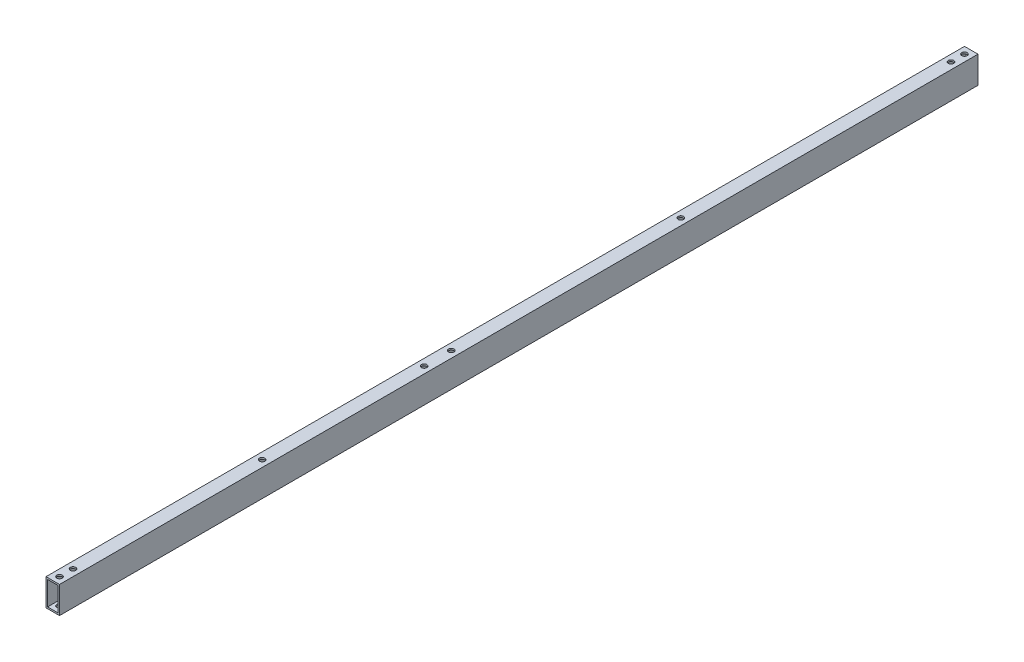
ISO-10303-21;
HEADER;
FILE_DESCRIPTION(('STEP AP214'),'2;1');
FILE_NAME('part.step','',(''),(''),'','','');
FILE_SCHEMA(('AUTOMOTIVE_DESIGN { 1 0 10303 214 1 1 1 1 }'));
ENDSEC;
DATA;
#1=APPLICATION_CONTEXT('core data for automotive mechanical design processes');
#2=APPLICATION_PROTOCOL_DEFINITION('international standard','automotive_design',2000,#1);
#3=PRODUCT_CONTEXT('',#1,'mechanical');
#4=PRODUCT('Part','Part','',(#3));
#5=PRODUCT_RELATED_PRODUCT_CATEGORY('part','',(#4));
#6=PRODUCT_DEFINITION_FORMATION('','',#4);
#7=PRODUCT_DEFINITION_CONTEXT('part definition',#1,'design');
#8=PRODUCT_DEFINITION('design','',#6,#7);
#9=PRODUCT_DEFINITION_SHAPE('','',#8);
#10=(LENGTH_UNIT() NAMED_UNIT(*) SI_UNIT(.MILLI.,.METRE.));
#11=(NAMED_UNIT(*) PLANE_ANGLE_UNIT() SI_UNIT($,.RADIAN.));
#12=(NAMED_UNIT(*) SI_UNIT($,.STERADIAN.) SOLID_ANGLE_UNIT());
#13=UNCERTAINTY_MEASURE_WITH_UNIT(LENGTH_MEASURE(1.E-05),#10,'distance_accuracy_value','');
#14=(GEOMETRIC_REPRESENTATION_CONTEXT(3) GLOBAL_UNCERTAINTY_ASSIGNED_CONTEXT((#13)) GLOBAL_UNIT_ASSIGNED_CONTEXT((#10,
#11,#12)) REPRESENTATION_CONTEXT('',''));
#15=CARTESIAN_POINT('',(0.,0.,0.));
#16=DIRECTION('',(0.,0.,1.));
#17=DIRECTION('',(1.,0.,0.));
#18=AXIS2_PLACEMENT_3D('',#15,#16,#17);
#19=CARTESIAN_POINT('',(0.,0.,680.));
#20=DIRECTION('',(0.,0.,1.));
#21=DIRECTION('',(1.,0.,0.));
#22=AXIS2_PLACEMENT_3D('',#19,#20,#21);
#23=PLANE('',#22);
#24=DIRECTION('',(0.,1.,0.));
#25=VECTOR('',#24,1.);
#26=CARTESIAN_POINT('',(5.,10.,680.));
#27=LINE('',#26,#25);
#28=CARTESIAN_POINT('',(5.,-10.,680.));
#29=VERTEX_POINT('',#28);
#30=CARTESIAN_POINT('',(5.,10.,680.));
#31=VERTEX_POINT('',#30);
#32=EDGE_CURVE('E164',#29,#31,#27,.T.);
#33=ORIENTED_EDGE('',*,*,#32,.T.);
#34=DIRECTION('',(-1.,0.,0.));
#35=VECTOR('',#34,1.);
#36=CARTESIAN_POINT('',(-5.,10.,680.));
#37=LINE('',#36,#35);
#38=CARTESIAN_POINT('',(-5.,10.,680.));
#39=VERTEX_POINT('',#38);
#40=EDGE_CURVE('E167',#31,#39,#37,.T.);
#41=ORIENTED_EDGE('',*,*,#40,.T.);
#42=DIRECTION('',(0.,-1.,0.));
#43=VECTOR('',#42,1.);
#44=CARTESIAN_POINT('',(-5.,10.,680.));
#45=LINE('',#44,#43);
#46=CARTESIAN_POINT('',(-5.,-10.,680.));
#47=VERTEX_POINT('',#46);
#48=EDGE_CURVE('E170',#39,#47,#45,.T.);
#49=ORIENTED_EDGE('',*,*,#48,.T.);
#50=DIRECTION('',(1.,0.,0.));
#51=VECTOR('',#50,1.);
#52=CARTESIAN_POINT('',(-5.,-10.,680.));
#53=LINE('',#52,#51);
#54=EDGE_CURVE('E172',#47,#29,#53,.T.);
#55=ORIENTED_EDGE('',*,*,#54,.T.);
#56=EDGE_LOOP('',(#33,#41,#49,#55));
#57=FACE_BOUND('',#56,.T.);
#58=DIRECTION('',(-1.,0.,0.));
#59=VECTOR('',#58,1.);
#60=CARTESIAN_POINT('',(-5.,8.8,680.));
#61=LINE('',#60,#59);
#62=CARTESIAN_POINT('',(3.8,8.8,680.));
#63=VERTEX_POINT('',#62);
#64=CARTESIAN_POINT('',(-3.8,8.8,680.));
#65=VERTEX_POINT('',#64);
#66=EDGE_CURVE('E134',#63,#65,#61,.T.);
#67=ORIENTED_EDGE('',*,*,#66,.F.);
#68=DIRECTION('',(0.,1.,0.));
#69=VECTOR('',#68,1.);
#70=CARTESIAN_POINT('',(3.8,10.,680.));
#71=LINE('',#70,#69);
#72=CARTESIAN_POINT('',(3.8,-8.8,680.));
#73=VERTEX_POINT('',#72);
#74=EDGE_CURVE('E126',#73,#63,#71,.T.);
#75=ORIENTED_EDGE('',*,*,#74,.F.);
#76=DIRECTION('',(1.,0.,0.));
#77=VECTOR('',#76,1.);
#78=CARTESIAN_POINT('',(-5.,-8.8,680.));
#79=LINE('',#78,#77);
#80=CARTESIAN_POINT('',(-3.8,-8.8,680.));
#81=VERTEX_POINT('',#80);
#82=EDGE_CURVE('E148',#81,#73,#79,.T.);
#83=ORIENTED_EDGE('',*,*,#82,.F.);
#84=DIRECTION('',(0.,-1.,0.));
#85=VECTOR('',#84,1.);
#86=CARTESIAN_POINT('',(-3.8,10.,680.));
#87=LINE('',#86,#85);
#88=EDGE_CURVE('E146',#65,#81,#87,.T.);
#89=ORIENTED_EDGE('',*,*,#88,.F.);
#90=EDGE_LOOP('',(#67,#75,#83,#89));
#91=FACE_BOUND('',#90,.T.);
#92=ADVANCED_FACE('F59',(#57,#91),#23,.T.);
#93=CARTESIAN_POINT('',(0.,0.,0.));
#94=DIRECTION('',(0.,0.,1.));
#95=DIRECTION('',(1.,0.,0.));
#96=AXIS2_PLACEMENT_3D('',#93,#94,#95);
#97=PLANE('',#96);
#98=DIRECTION('',(0.,1.,0.));
#99=VECTOR('',#98,1.);
#100=CARTESIAN_POINT('',(5.,10.,0.));
#101=LINE('',#100,#99);
#102=CARTESIAN_POINT('',(5.,-10.,0.));
#103=VERTEX_POINT('',#102);
#104=CARTESIAN_POINT('',(5.,10.,0.));
#105=VERTEX_POINT('',#104);
#106=EDGE_CURVE('E142',#103,#105,#101,.T.);
#107=ORIENTED_EDGE('',*,*,#106,.F.);
#108=DIRECTION('',(1.,0.,0.));
#109=VECTOR('',#108,1.);
#110=CARTESIAN_POINT('',(-5.,-10.,0.));
#111=LINE('',#110,#109);
#112=CARTESIAN_POINT('',(-5.,-10.,0.));
#113=VERTEX_POINT('',#112);
#114=EDGE_CURVE('E168',#113,#103,#111,.T.);
#115=ORIENTED_EDGE('',*,*,#114,.F.);
#116=DIRECTION('',(0.,-1.,0.));
#117=VECTOR('',#116,1.);
#118=CARTESIAN_POINT('',(-5.,10.,0.));
#119=LINE('',#118,#117);
#120=CARTESIAN_POINT('',(-5.,10.,0.));
#121=VERTEX_POINT('',#120);
#122=EDGE_CURVE('E179',#121,#113,#119,.T.);
#123=ORIENTED_EDGE('',*,*,#122,.F.);
#124=DIRECTION('',(-1.,0.,0.));
#125=VECTOR('',#124,1.);
#126=CARTESIAN_POINT('',(-5.,10.,0.));
#127=LINE('',#126,#125);
#128=EDGE_CURVE('E177',#105,#121,#127,.T.);
#129=ORIENTED_EDGE('',*,*,#128,.F.);
#130=EDGE_LOOP('',(#107,#115,#123,#129));
#131=FACE_BOUND('',#130,.T.);
#132=DIRECTION('',(0.,1.,0.));
#133=VECTOR('',#132,1.);
#134=CARTESIAN_POINT('',(3.8,10.,0.));
#135=LINE('',#134,#133);
#136=CARTESIAN_POINT('',(3.8,-8.8,0.));
#137=VERTEX_POINT('',#136);
#138=CARTESIAN_POINT('',(3.8,8.8,0.));
#139=VERTEX_POINT('',#138);
#140=EDGE_CURVE('E84',#137,#139,#135,.T.);
#141=ORIENTED_EDGE('',*,*,#140,.T.);
#142=DIRECTION('',(-1.,0.,0.));
#143=VECTOR('',#142,1.);
#144=CARTESIAN_POINT('',(-5.,8.8,0.));
#145=LINE('',#144,#143);
#146=CARTESIAN_POINT('',(-3.8,8.8,0.));
#147=VERTEX_POINT('',#146);
#148=EDGE_CURVE('E141',#139,#147,#145,.T.);
#149=ORIENTED_EDGE('',*,*,#148,.T.);
#150=DIRECTION('',(0.,-1.,0.));
#151=VECTOR('',#150,1.);
#152=CARTESIAN_POINT('',(-3.8,10.,0.));
#153=LINE('',#152,#151);
#154=CARTESIAN_POINT('',(-3.8,-8.8,0.));
#155=VERTEX_POINT('',#154);
#156=EDGE_CURVE('E156',#147,#155,#153,.T.);
#157=ORIENTED_EDGE('',*,*,#156,.T.);
#158=DIRECTION('',(1.,0.,0.));
#159=VECTOR('',#158,1.);
#160=CARTESIAN_POINT('',(-5.,-8.8,0.));
#161=LINE('',#160,#159);
#162=EDGE_CURVE('E135',#155,#137,#161,.T.);
#163=ORIENTED_EDGE('',*,*,#162,.T.);
#164=EDGE_LOOP('',(#141,#149,#157,#163));
#165=FACE_BOUND('',#164,.T.);
#166=ADVANCED_FACE('F255',(#131,#165),#97,.F.);
#167=CARTESIAN_POINT('',(5.,10.,680.));
#168=DIRECTION('',(-1.,0.,0.));
#169=DIRECTION('',(0.,-1.,0.));
#170=AXIS2_PLACEMENT_3D('',#167,#168,#169);
#171=PLANE('',#170);
#172=ORIENTED_EDGE('',*,*,#106,.T.);
#173=DIRECTION('',(0.,0.,-1.));
#174=VECTOR('',#173,1.);
#175=CARTESIAN_POINT('',(5.,10.,680.));
#176=LINE('',#175,#174);
#177=EDGE_CURVE('E12',#31,#105,#176,.T.);
#178=ORIENTED_EDGE('',*,*,#177,.F.);
#179=ORIENTED_EDGE('',*,*,#32,.F.);
#180=DIRECTION('',(0.,0.,-1.));
#181=VECTOR('',#180,1.);
#182=CARTESIAN_POINT('',(5.,-10.,680.));
#183=LINE('',#182,#181);
#184=EDGE_CURVE('E174',#29,#103,#183,.T.);
#185=ORIENTED_EDGE('',*,*,#184,.T.);
#186=EDGE_LOOP('',(#172,#178,#179,#185));
#187=FACE_BOUND('',#186,.T.);
#188=ADVANCED_FACE('F61',(#187),#171,.F.);
#189=CARTESIAN_POINT('',(-5.,10.,680.));
#190=DIRECTION('',(0.,-1.,0.));
#191=DIRECTION('',(0.,0.,-1.));
#192=AXIS2_PLACEMENT_3D('',#189,#190,#191);
#193=PLANE('',#192);
#194=CARTESIAN_POINT('',(0.,10.,525.));
#195=DIRECTION('',(0.,1.,0.));
#196=DIRECTION('',(0.,0.,1.));
#197=AXIS2_PLACEMENT_3D('',#194,#195,#196);
#198=CIRCLE('',#197,1.99999999999999);
#199=CARTESIAN_POINT('',(0.,10.,527.));
#200=VERTEX_POINT('',#199);
#201=EDGE_CURVE('E291',#200,#200,#198,.T.);
#202=ORIENTED_EDGE('',*,*,#201,.F.);
#203=EDGE_LOOP('',(#202));
#204=FACE_BOUND('',#203,.T.);
#205=CARTESIAN_POINT('',(0.,10.,15.));
#206=DIRECTION('',(0.,1.,0.));
#207=DIRECTION('',(0.,0.,-1.));
#208=AXIS2_PLACEMENT_3D('',#205,#206,#207);
#209=CIRCLE('',#208,2.);
#210=CARTESIAN_POINT('',(0.,10.,13.));
#211=VERTEX_POINT('',#210);
#212=EDGE_CURVE('E295',#211,#211,#209,.T.);
#213=ORIENTED_EDGE('',*,*,#212,.F.);
#214=EDGE_LOOP('',(#213));
#215=FACE_BOUND('',#214,.T.);
#216=CARTESIAN_POINT('',(0.,10.,5.));
#217=DIRECTION('',(0.,1.,0.));
#218=DIRECTION('',(0.,0.,-1.));
#219=AXIS2_PLACEMENT_3D('',#216,#217,#218);
#220=CIRCLE('',#219,2.);
#221=CARTESIAN_POINT('',(0.,10.,3.));
#222=VERTEX_POINT('',#221);
#223=EDGE_CURVE('E299',#222,#222,#220,.T.);
#224=ORIENTED_EDGE('',*,*,#223,.F.);
#225=EDGE_LOOP('',(#224));
#226=FACE_BOUND('',#225,.T.);
#227=CARTESIAN_POINT('',(0.,10.,675.));
#228=DIRECTION('',(0.,1.,0.));
#229=DIRECTION('',(0.,0.,1.));
#230=AXIS2_PLACEMENT_3D('',#227,#228,#229);
#231=CIRCLE('',#230,2.);
#232=CARTESIAN_POINT('',(0.,10.,677.));
#233=VERTEX_POINT('',#232);
#234=EDGE_CURVE('E303',#233,#233,#231,.T.);
#235=ORIENTED_EDGE('',*,*,#234,.F.);
#236=EDGE_LOOP('',(#235));
#237=FACE_BOUND('',#236,.T.);
#238=CARTESIAN_POINT('',(-4.80234859844007E-13,10.,385.));
#239=DIRECTION('',(0.,1.,0.));
#240=DIRECTION('',(0.,0.,1.));
#241=AXIS2_PLACEMENT_3D('',#238,#239,#240);
#242=CIRCLE('',#241,2.);
#243=CARTESIAN_POINT('',(-4.80234859844007E-13,10.,387.));
#244=VERTEX_POINT('',#243);
#245=EDGE_CURVE('E307',#244,#244,#242,.T.);
#246=ORIENTED_EDGE('',*,*,#245,.F.);
#247=EDGE_LOOP('',(#246));
#248=FACE_BOUND('',#247,.T.);
#249=CARTESIAN_POINT('',(0.,10.,215.));
#250=DIRECTION('',(0.,1.,0.));
#251=DIRECTION('',(0.,0.,1.));
#252=AXIS2_PLACEMENT_3D('',#249,#250,#251);
#253=CIRCLE('',#252,2.);
#254=CARTESIAN_POINT('',(0.,10.,217.));
#255=VERTEX_POINT('',#254);
#256=EDGE_CURVE('E311',#255,#255,#253,.T.);
#257=ORIENTED_EDGE('',*,*,#256,.F.);
#258=EDGE_LOOP('',(#257));
#259=FACE_BOUND('',#258,.T.);
#260=CARTESIAN_POINT('',(-4.11629879866292E-13,10.,405.));
#261=DIRECTION('',(0.,1.,0.));
#262=DIRECTION('',(0.,0.,1.));
#263=AXIS2_PLACEMENT_3D('',#260,#261,#262);
#264=CIRCLE('',#263,2.);
#265=CARTESIAN_POINT('',(-4.11629879866292E-13,10.,407.));
#266=VERTEX_POINT('',#265);
#267=EDGE_CURVE('E315',#266,#266,#264,.T.);
#268=ORIENTED_EDGE('',*,*,#267,.F.);
#269=EDGE_LOOP('',(#268));
#270=FACE_BOUND('',#269,.T.);
#271=CARTESIAN_POINT('',(0.,10.,665.));
#272=DIRECTION('',(0.,1.,0.));
#273=DIRECTION('',(0.,0.,1.));
#274=AXIS2_PLACEMENT_3D('',#271,#272,#273);
#275=CIRCLE('',#274,2.);
#276=CARTESIAN_POINT('',(0.,10.,667.));
#277=VERTEX_POINT('',#276);
#278=EDGE_CURVE('E319',#277,#277,#275,.T.);
#279=ORIENTED_EDGE('',*,*,#278,.F.);
#280=EDGE_LOOP('',(#279));
#281=FACE_BOUND('',#280,.T.);
#282=ORIENTED_EDGE('',*,*,#128,.T.);
#283=DIRECTION('',(0.,0.,-1.));
#284=VECTOR('',#283,1.);
#285=CARTESIAN_POINT('',(-5.,10.,680.));
#286=LINE('',#285,#284);
#287=EDGE_CURVE('E68',#39,#121,#286,.T.);
#288=ORIENTED_EDGE('',*,*,#287,.F.);
#289=ORIENTED_EDGE('',*,*,#40,.F.);
#290=ORIENTED_EDGE('',*,*,#177,.T.);
#291=EDGE_LOOP('',(#282,#288,#289,#290));
#292=FACE_BOUND('',#291,.T.);
#293=ADVANCED_FACE('F280',(#204,#215,#226,#237,#248,#259,#270,#281,#292),#193,.F.);
#294=CARTESIAN_POINT('',(-5.,10.,680.));
#295=DIRECTION('',(1.,0.,0.));
#296=DIRECTION('',(0.,1.,0.));
#297=AXIS2_PLACEMENT_3D('',#294,#295,#296);
#298=PLANE('',#297);
#299=ORIENTED_EDGE('',*,*,#122,.T.);
#300=DIRECTION('',(0.,0.,-1.));
#301=VECTOR('',#300,1.);
#302=CARTESIAN_POINT('',(-5.,-10.,680.));
#303=LINE('',#302,#301);
#304=EDGE_CURVE('E184',#47,#113,#303,.T.);
#305=ORIENTED_EDGE('',*,*,#304,.F.);
#306=ORIENTED_EDGE('',*,*,#48,.F.);
#307=ORIENTED_EDGE('',*,*,#287,.T.);
#308=EDGE_LOOP('',(#299,#305,#306,#307));
#309=FACE_BOUND('',#308,.T.);
#310=ADVANCED_FACE('F277',(#309),#298,.F.);
#311=CARTESIAN_POINT('',(-5.,-10.,680.));
#312=DIRECTION('',(0.,1.,0.));
#313=DIRECTION('',(0.,0.,1.));
#314=AXIS2_PLACEMENT_3D('',#311,#312,#313);
#315=PLANE('',#314);
#316=CARTESIAN_POINT('',(0.,-10.,525.));
#317=DIRECTION('',(0.,1.,0.));
#318=DIRECTION('',(0.,0.,1.));
#319=AXIS2_PLACEMENT_3D('',#316,#317,#318);
#320=CIRCLE('',#319,1.99999999999999);
#321=CARTESIAN_POINT('',(0.,-10.,527.));
#322=VERTEX_POINT('',#321);
#323=EDGE_CURVE('E424',#322,#322,#320,.T.);
#324=ORIENTED_EDGE('',*,*,#323,.T.);
#325=EDGE_LOOP('',(#324));
#326=FACE_BOUND('',#325,.T.);
#327=CARTESIAN_POINT('',(0.,-10.,15.));
#328=DIRECTION('',(0.,1.,0.));
#329=DIRECTION('',(0.,0.,-1.));
#330=AXIS2_PLACEMENT_3D('',#327,#328,#329);
#331=CIRCLE('',#330,2.);
#332=CARTESIAN_POINT('',(0.,-10.,13.));
#333=VERTEX_POINT('',#332);
#334=EDGE_CURVE('E416',#333,#333,#331,.T.);
#335=ORIENTED_EDGE('',*,*,#334,.T.);
#336=EDGE_LOOP('',(#335));
#337=FACE_BOUND('',#336,.T.);
#338=CARTESIAN_POINT('',(0.,-10.,5.));
#339=DIRECTION('',(0.,1.,0.));
#340=DIRECTION('',(0.,0.,-1.));
#341=AXIS2_PLACEMENT_3D('',#338,#339,#340);
#342=CIRCLE('',#341,2.);
#343=CARTESIAN_POINT('',(0.,-10.,3.));
#344=VERTEX_POINT('',#343);
#345=EDGE_CURVE('E415',#344,#344,#342,.T.);
#346=ORIENTED_EDGE('',*,*,#345,.T.);
#347=EDGE_LOOP('',(#346));
#348=FACE_BOUND('',#347,.T.);
#349=CARTESIAN_POINT('',(0.,-10.,675.));
#350=DIRECTION('',(0.,1.,0.));
#351=DIRECTION('',(0.,0.,1.));
#352=AXIS2_PLACEMENT_3D('',#349,#350,#351);
#353=CIRCLE('',#352,2.);
#354=CARTESIAN_POINT('',(0.,-10.,677.));
#355=VERTEX_POINT('',#354);
#356=EDGE_CURVE('E332',#355,#355,#353,.T.);
#357=ORIENTED_EDGE('',*,*,#356,.T.);
#358=EDGE_LOOP('',(#357));
#359=FACE_BOUND('',#358,.T.);
#360=CARTESIAN_POINT('',(-4.80234859844007E-13,-10.,385.));
#361=DIRECTION('',(0.,1.,0.));
#362=DIRECTION('',(0.,0.,1.));
#363=AXIS2_PLACEMENT_3D('',#360,#361,#362);
#364=CIRCLE('',#363,2.);
#365=CARTESIAN_POINT('',(-4.80234859844007E-13,-10.,387.));
#366=VERTEX_POINT('',#365);
#367=EDGE_CURVE('E431',#366,#366,#364,.T.);
#368=ORIENTED_EDGE('',*,*,#367,.T.);
#369=EDGE_LOOP('',(#368));
#370=FACE_BOUND('',#369,.T.);
#371=CARTESIAN_POINT('',(0.,-10.,215.));
#372=DIRECTION('',(0.,1.,0.));
#373=DIRECTION('',(0.,0.,1.));
#374=AXIS2_PLACEMENT_3D('',#371,#372,#373);
#375=CIRCLE('',#374,2.);
#376=CARTESIAN_POINT('',(0.,-10.,217.));
#377=VERTEX_POINT('',#376);
#378=EDGE_CURVE('E430',#377,#377,#375,.T.);
#379=ORIENTED_EDGE('',*,*,#378,.T.);
#380=EDGE_LOOP('',(#379));
#381=FACE_BOUND('',#380,.T.);
#382=CARTESIAN_POINT('',(-4.11629879866292E-13,-10.,405.));
#383=DIRECTION('',(0.,1.,0.));
#384=DIRECTION('',(0.,0.,1.));
#385=AXIS2_PLACEMENT_3D('',#382,#383,#384);
#386=CIRCLE('',#385,2.);
#387=CARTESIAN_POINT('',(-4.11629879866292E-13,-10.,407.));
#388=VERTEX_POINT('',#387);
#389=EDGE_CURVE('E425',#388,#388,#386,.T.);
#390=ORIENTED_EDGE('',*,*,#389,.T.);
#391=EDGE_LOOP('',(#390));
#392=FACE_BOUND('',#391,.T.);
#393=CARTESIAN_POINT('',(0.,-10.,665.));
#394=DIRECTION('',(0.,1.,0.));
#395=DIRECTION('',(0.,0.,1.));
#396=AXIS2_PLACEMENT_3D('',#393,#394,#395);
#397=CIRCLE('',#396,2.);
#398=CARTESIAN_POINT('',(0.,-10.,667.));
#399=VERTEX_POINT('',#398);
#400=EDGE_CURVE('E193',#399,#399,#397,.T.);
#401=ORIENTED_EDGE('',*,*,#400,.T.);
#402=EDGE_LOOP('',(#401));
#403=FACE_BOUND('',#402,.T.);
#404=ORIENTED_EDGE('',*,*,#114,.T.);
#405=ORIENTED_EDGE('',*,*,#184,.F.);
#406=ORIENTED_EDGE('',*,*,#54,.F.);
#407=ORIENTED_EDGE('',*,*,#304,.T.);
#408=EDGE_LOOP('',(#404,#405,#406,#407));
#409=FACE_BOUND('',#408,.T.);
#410=ADVANCED_FACE('F274',(#326,#337,#348,#359,#370,#381,#392,#403,#409),#315,.F.);
#411=CARTESIAN_POINT('',(3.8,10.,680.));
#412=DIRECTION('',(-1.,0.,0.));
#413=DIRECTION('',(0.,-1.,0.));
#414=AXIS2_PLACEMENT_3D('',#411,#412,#413);
#415=PLANE('',#414);
#416=ORIENTED_EDGE('',*,*,#140,.F.);
#417=DIRECTION('',(0.,0.,-1.));
#418=VECTOR('',#417,1.);
#419=CARTESIAN_POINT('',(3.8,-8.8,680.));
#420=LINE('',#419,#418);
#421=EDGE_CURVE('E130',#73,#137,#420,.T.);
#422=ORIENTED_EDGE('',*,*,#421,.F.);
#423=ORIENTED_EDGE('',*,*,#74,.T.);
#424=DIRECTION('',(0.,0.,-1.));
#425=VECTOR('',#424,1.);
#426=CARTESIAN_POINT('',(3.8,8.8,680.));
#427=LINE('',#426,#425);
#428=EDGE_CURVE('E129',#63,#139,#427,.T.);
#429=ORIENTED_EDGE('',*,*,#428,.T.);
#430=EDGE_LOOP('',(#416,#422,#423,#429));
#431=FACE_BOUND('',#430,.T.);
#432=ADVANCED_FACE('F128',(#431),#415,.T.);
#433=CARTESIAN_POINT('',(-5.,8.8,680.));
#434=DIRECTION('',(0.,-1.,0.));
#435=DIRECTION('',(0.,0.,-1.));
#436=AXIS2_PLACEMENT_3D('',#433,#434,#435);
#437=PLANE('',#436);
#438=CARTESIAN_POINT('',(0.,8.8,525.));
#439=DIRECTION('',(0.,-1.,0.));
#440=DIRECTION('',(0.,0.,-1.));
#441=AXIS2_PLACEMENT_3D('',#438,#439,#440);
#442=CIRCLE('',#441,1.99999999999999);
#443=CARTESIAN_POINT('',(0.,8.8,523.));
#444=VERTEX_POINT('',#443);
#445=EDGE_CURVE('E154',#444,#444,#442,.T.);
#446=ORIENTED_EDGE('',*,*,#445,.F.);
#447=EDGE_LOOP('',(#446));
#448=FACE_BOUND('',#447,.T.);
#449=CARTESIAN_POINT('',(0.,8.8,15.));
#450=DIRECTION('',(0.,-1.,0.));
#451=DIRECTION('',(0.,0.,-1.));
#452=AXIS2_PLACEMENT_3D('',#449,#450,#451);
#453=CIRCLE('',#452,2.);
#454=CARTESIAN_POINT('',(0.,8.8,13.));
#455=VERTEX_POINT('',#454);
#456=EDGE_CURVE('E215',#455,#455,#453,.T.);
#457=ORIENTED_EDGE('',*,*,#456,.F.);
#458=EDGE_LOOP('',(#457));
#459=FACE_BOUND('',#458,.T.);
#460=CARTESIAN_POINT('',(0.,8.8,5.));
#461=DIRECTION('',(0.,-1.,0.));
#462=DIRECTION('',(0.,0.,-1.));
#463=AXIS2_PLACEMENT_3D('',#460,#461,#462);
#464=CIRCLE('',#463,2.);
#465=CARTESIAN_POINT('',(0.,8.8,3.));
#466=VERTEX_POINT('',#465);
#467=EDGE_CURVE('E212',#466,#466,#464,.T.);
#468=ORIENTED_EDGE('',*,*,#467,.F.);
#469=EDGE_LOOP('',(#468));
#470=FACE_BOUND('',#469,.T.);
#471=CARTESIAN_POINT('',(0.,8.8,675.));
#472=DIRECTION('',(0.,-1.,0.));
#473=DIRECTION('',(0.,0.,-1.));
#474=AXIS2_PLACEMENT_3D('',#471,#472,#473);
#475=CIRCLE('',#474,2.);
#476=CARTESIAN_POINT('',(0.,8.8,673.));
#477=VERTEX_POINT('',#476);
#478=EDGE_CURVE('E209',#477,#477,#475,.T.);
#479=ORIENTED_EDGE('',*,*,#478,.F.);
#480=EDGE_LOOP('',(#479));
#481=FACE_BOUND('',#480,.T.);
#482=CARTESIAN_POINT('',(-4.80234859844007E-13,8.8,385.));
#483=DIRECTION('',(0.,-1.,0.));
#484=DIRECTION('',(0.,0.,-1.));
#485=AXIS2_PLACEMENT_3D('',#482,#483,#484);
#486=CIRCLE('',#485,2.);
#487=CARTESIAN_POINT('',(-4.80234859844007E-13,8.8,383.));
#488=VERTEX_POINT('',#487);
#489=EDGE_CURVE('E205',#488,#488,#486,.T.);
#490=ORIENTED_EDGE('',*,*,#489,.F.);
#491=EDGE_LOOP('',(#490));
#492=FACE_BOUND('',#491,.T.);
#493=CARTESIAN_POINT('',(0.,8.8,215.));
#494=DIRECTION('',(0.,-1.,0.));
#495=DIRECTION('',(0.,0.,-1.));
#496=AXIS2_PLACEMENT_3D('',#493,#494,#495);
#497=CIRCLE('',#496,2.);
#498=CARTESIAN_POINT('',(0.,8.8,213.));
#499=VERTEX_POINT('',#498);
#500=EDGE_CURVE('E201',#499,#499,#497,.T.);
#501=ORIENTED_EDGE('',*,*,#500,.F.);
#502=EDGE_LOOP('',(#501));
#503=FACE_BOUND('',#502,.T.);
#504=CARTESIAN_POINT('',(-4.11629879866292E-13,8.8,405.));
#505=DIRECTION('',(0.,-1.,0.));
#506=DIRECTION('',(0.,0.,-1.));
#507=AXIS2_PLACEMENT_3D('',#504,#505,#506);
#508=CIRCLE('',#507,2.);
#509=CARTESIAN_POINT('',(-4.11629879866292E-13,8.8,403.));
#510=VERTEX_POINT('',#509);
#511=EDGE_CURVE('E197',#510,#510,#508,.T.);
#512=ORIENTED_EDGE('',*,*,#511,.F.);
#513=EDGE_LOOP('',(#512));
#514=FACE_BOUND('',#513,.T.);
#515=CARTESIAN_POINT('',(0.,8.8,665.));
#516=DIRECTION('',(0.,-1.,0.));
#517=DIRECTION('',(0.,0.,-1.));
#518=AXIS2_PLACEMENT_3D('',#515,#516,#517);
#519=CIRCLE('',#518,2.);
#520=CARTESIAN_POINT('',(0.,8.8,663.));
#521=VERTEX_POINT('',#520);
#522=EDGE_CURVE('E192',#521,#521,#519,.T.);
#523=ORIENTED_EDGE('',*,*,#522,.F.);
#524=EDGE_LOOP('',(#523));
#525=FACE_BOUND('',#524,.T.);
#526=ORIENTED_EDGE('',*,*,#148,.F.);
#527=ORIENTED_EDGE('',*,*,#428,.F.);
#528=ORIENTED_EDGE('',*,*,#66,.T.);
#529=DIRECTION('',(0.,0.,-1.));
#530=VECTOR('',#529,1.);
#531=CARTESIAN_POINT('',(-3.8,8.8,680.));
#532=LINE('',#531,#530);
#533=EDGE_CURVE('E143',#65,#147,#532,.T.);
#534=ORIENTED_EDGE('',*,*,#533,.T.);
#535=EDGE_LOOP('',(#526,#527,#528,#534));
#536=FACE_BOUND('',#535,.T.);
#537=ADVANCED_FACE('F138',(#448,#459,#470,#481,#492,#503,#514,#525,#536),#437,.T.);
#538=CARTESIAN_POINT('',(-3.8,10.,680.));
#539=DIRECTION('',(1.,0.,0.));
#540=DIRECTION('',(0.,1.,0.));
#541=AXIS2_PLACEMENT_3D('',#538,#539,#540);
#542=PLANE('',#541);
#543=ORIENTED_EDGE('',*,*,#156,.F.);
#544=ORIENTED_EDGE('',*,*,#533,.F.);
#545=ORIENTED_EDGE('',*,*,#88,.T.);
#546=DIRECTION('',(0.,0.,-1.));
#547=VECTOR('',#546,1.);
#548=CARTESIAN_POINT('',(-3.8,-8.8,680.));
#549=LINE('',#548,#547);
#550=EDGE_CURVE('E76',#81,#155,#549,.T.);
#551=ORIENTED_EDGE('',*,*,#550,.T.);
#552=EDGE_LOOP('',(#543,#544,#545,#551));
#553=FACE_BOUND('',#552,.T.);
#554=ADVANCED_FACE('F239',(#553),#542,.T.);
#555=CARTESIAN_POINT('',(-5.,-8.8,680.));
#556=DIRECTION('',(0.,1.,0.));
#557=DIRECTION('',(0.,0.,1.));
#558=AXIS2_PLACEMENT_3D('',#555,#556,#557);
#559=PLANE('',#558);
#560=CARTESIAN_POINT('',(0.,-8.8,525.));
#561=DIRECTION('',(0.,1.,0.));
#562=DIRECTION('',(0.,0.,1.));
#563=AXIS2_PLACEMENT_3D('',#560,#561,#562);
#564=CIRCLE('',#563,1.99999999999999);
#565=CARTESIAN_POINT('',(0.,-8.8,527.));
#566=VERTEX_POINT('',#565);
#567=EDGE_CURVE('E63',#566,#566,#564,.T.);
#568=ORIENTED_EDGE('',*,*,#567,.F.);
#569=EDGE_LOOP('',(#568));
#570=FACE_BOUND('',#569,.T.);
#571=CARTESIAN_POINT('',(0.,-8.8,15.));
#572=DIRECTION('',(0.,1.,0.));
#573=DIRECTION('',(0.,0.,1.));
#574=AXIS2_PLACEMENT_3D('',#571,#572,#573);
#575=CIRCLE('',#574,2.);
#576=CARTESIAN_POINT('',(0.,-8.8,17.));
#577=VERTEX_POINT('',#576);
#578=EDGE_CURVE('E213',#577,#577,#575,.T.);
#579=ORIENTED_EDGE('',*,*,#578,.F.);
#580=EDGE_LOOP('',(#579));
#581=FACE_BOUND('',#580,.T.);
#582=CARTESIAN_POINT('',(0.,-8.8,5.));
#583=DIRECTION('',(0.,1.,0.));
#584=DIRECTION('',(0.,0.,1.));
#585=AXIS2_PLACEMENT_3D('',#582,#583,#584);
#586=CIRCLE('',#585,2.);
#587=CARTESIAN_POINT('',(0.,-8.8,7.00000000000001));
#588=VERTEX_POINT('',#587);
#589=EDGE_CURVE('E210',#588,#588,#586,.T.);
#590=ORIENTED_EDGE('',*,*,#589,.F.);
#591=EDGE_LOOP('',(#590));
#592=FACE_BOUND('',#591,.T.);
#593=CARTESIAN_POINT('',(0.,-8.8,675.));
#594=DIRECTION('',(0.,1.,0.));
#595=DIRECTION('',(0.,0.,1.));
#596=AXIS2_PLACEMENT_3D('',#593,#594,#595);
#597=CIRCLE('',#596,2.);
#598=CARTESIAN_POINT('',(0.,-8.8,677.));
#599=VERTEX_POINT('',#598);
#600=EDGE_CURVE('E206',#599,#599,#597,.T.);
#601=ORIENTED_EDGE('',*,*,#600,.F.);
#602=EDGE_LOOP('',(#601));
#603=FACE_BOUND('',#602,.T.);
#604=CARTESIAN_POINT('',(-4.80234859844007E-13,-8.8,385.));
#605=DIRECTION('',(0.,1.,0.));
#606=DIRECTION('',(0.,0.,1.));
#607=AXIS2_PLACEMENT_3D('',#604,#605,#606);
#608=CIRCLE('',#607,2.);
#609=CARTESIAN_POINT('',(-4.80234859844007E-13,-8.8,387.));
#610=VERTEX_POINT('',#609);
#611=EDGE_CURVE('E202',#610,#610,#608,.T.);
#612=ORIENTED_EDGE('',*,*,#611,.F.);
#613=EDGE_LOOP('',(#612));
#614=FACE_BOUND('',#613,.T.);
#615=CARTESIAN_POINT('',(0.,-8.8,215.));
#616=DIRECTION('',(0.,1.,0.));
#617=DIRECTION('',(0.,0.,1.));
#618=AXIS2_PLACEMENT_3D('',#615,#616,#617);
#619=CIRCLE('',#618,2.);
#620=CARTESIAN_POINT('',(0.,-8.8,217.));
#621=VERTEX_POINT('',#620);
#622=EDGE_CURVE('E198',#621,#621,#619,.T.);
#623=ORIENTED_EDGE('',*,*,#622,.F.);
#624=EDGE_LOOP('',(#623));
#625=FACE_BOUND('',#624,.T.);
#626=CARTESIAN_POINT('',(-4.11629879866292E-13,-8.8,405.));
#627=DIRECTION('',(0.,1.,0.));
#628=DIRECTION('',(0.,0.,1.));
#629=AXIS2_PLACEMENT_3D('',#626,#627,#628);
#630=CIRCLE('',#629,2.);
#631=CARTESIAN_POINT('',(-4.11629879866292E-13,-8.8,407.));
#632=VERTEX_POINT('',#631);
#633=EDGE_CURVE('E194',#632,#632,#630,.T.);
#634=ORIENTED_EDGE('',*,*,#633,.F.);
#635=EDGE_LOOP('',(#634));
#636=FACE_BOUND('',#635,.T.);
#637=CARTESIAN_POINT('',(0.,-8.8,665.));
#638=DIRECTION('',(0.,1.,0.));
#639=DIRECTION('',(0.,0.,1.));
#640=AXIS2_PLACEMENT_3D('',#637,#638,#639);
#641=CIRCLE('',#640,2.);
#642=CARTESIAN_POINT('',(0.,-8.8,667.));
#643=VERTEX_POINT('',#642);
#644=EDGE_CURVE('E189',#643,#643,#641,.T.);
#645=ORIENTED_EDGE('',*,*,#644,.F.);
#646=EDGE_LOOP('',(#645));
#647=FACE_BOUND('',#646,.T.);
#648=ORIENTED_EDGE('',*,*,#162,.F.);
#649=ORIENTED_EDGE('',*,*,#550,.F.);
#650=ORIENTED_EDGE('',*,*,#82,.T.);
#651=ORIENTED_EDGE('',*,*,#421,.T.);
#652=EDGE_LOOP('',(#648,#649,#650,#651));
#653=FACE_BOUND('',#652,.T.);
#654=ADVANCED_FACE('F235',(#570,#581,#592,#603,#614,#625,#636,#647,#653),#559,.T.);
#655=CARTESIAN_POINT('',(0.,-10.,665.));
#656=DIRECTION('',(0.,1.,0.));
#657=DIRECTION('',(0.,0.,1.));
#658=AXIS2_PLACEMENT_3D('',#655,#656,#657);
#659=CYLINDRICAL_SURFACE('',#658,2.);
#660=ORIENTED_EDGE('',*,*,#644,.T.);
#661=EDGE_LOOP('',(#660));
#662=FACE_BOUND('',#661,.T.);
#663=ORIENTED_EDGE('',*,*,#400,.F.);
#664=EDGE_LOOP('',(#663));
#665=FACE_BOUND('',#664,.T.);
#666=ADVANCED_FACE('F238',(#662,#665),#659,.F.);
#667=CARTESIAN_POINT('',(-4.11629879866292E-13,-10.,405.));
#668=DIRECTION('',(0.,1.,0.));
#669=DIRECTION('',(0.,0.,1.));
#670=AXIS2_PLACEMENT_3D('',#667,#668,#669);
#671=CYLINDRICAL_SURFACE('',#670,2.);
#672=ORIENTED_EDGE('',*,*,#633,.T.);
#673=EDGE_LOOP('',(#672));
#674=FACE_BOUND('',#673,.T.);
#675=ORIENTED_EDGE('',*,*,#389,.F.);
#676=EDGE_LOOP('',(#675));
#677=FACE_BOUND('',#676,.T.);
#678=ADVANCED_FACE('F369',(#674,#677),#671,.F.);
#679=CARTESIAN_POINT('',(0.,-10.,215.));
#680=DIRECTION('',(0.,1.,0.));
#681=DIRECTION('',(0.,0.,1.));
#682=AXIS2_PLACEMENT_3D('',#679,#680,#681);
#683=CYLINDRICAL_SURFACE('',#682,2.);
#684=ORIENTED_EDGE('',*,*,#622,.T.);
#685=EDGE_LOOP('',(#684));
#686=FACE_BOUND('',#685,.T.);
#687=ORIENTED_EDGE('',*,*,#378,.F.);
#688=EDGE_LOOP('',(#687));
#689=FACE_BOUND('',#688,.T.);
#690=ADVANCED_FACE('F379',(#686,#689),#683,.F.);
#691=CARTESIAN_POINT('',(-4.80234859844007E-13,-10.,385.));
#692=DIRECTION('',(0.,1.,0.));
#693=DIRECTION('',(0.,0.,1.));
#694=AXIS2_PLACEMENT_3D('',#691,#692,#693);
#695=CYLINDRICAL_SURFACE('',#694,2.);
#696=ORIENTED_EDGE('',*,*,#611,.T.);
#697=EDGE_LOOP('',(#696));
#698=FACE_BOUND('',#697,.T.);
#699=ORIENTED_EDGE('',*,*,#367,.F.);
#700=EDGE_LOOP('',(#699));
#701=FACE_BOUND('',#700,.T.);
#702=ADVANCED_FACE('F387',(#698,#701),#695,.F.);
#703=CARTESIAN_POINT('',(0.,-10.,675.));
#704=DIRECTION('',(0.,1.,0.));
#705=DIRECTION('',(0.,0.,1.));
#706=AXIS2_PLACEMENT_3D('',#703,#704,#705);
#707=CYLINDRICAL_SURFACE('',#706,2.);
#708=ORIENTED_EDGE('',*,*,#600,.T.);
#709=EDGE_LOOP('',(#708));
#710=FACE_BOUND('',#709,.T.);
#711=ORIENTED_EDGE('',*,*,#356,.F.);
#712=EDGE_LOOP('',(#711));
#713=FACE_BOUND('',#712,.T.);
#714=ADVANCED_FACE('F397',(#710,#713),#707,.F.);
#715=CARTESIAN_POINT('',(0.,-10.,5.));
#716=DIRECTION('',(0.,1.,0.));
#717=DIRECTION('',(0.,0.,1.));
#718=AXIS2_PLACEMENT_3D('',#715,#716,#717);
#719=CYLINDRICAL_SURFACE('',#718,2.);
#720=ORIENTED_EDGE('',*,*,#589,.T.);
#721=EDGE_LOOP('',(#720));
#722=FACE_BOUND('',#721,.T.);
#723=ORIENTED_EDGE('',*,*,#345,.F.);
#724=EDGE_LOOP('',(#723));
#725=FACE_BOUND('',#724,.T.);
#726=ADVANCED_FACE('F394',(#722,#725),#719,.F.);
#727=CARTESIAN_POINT('',(0.,-10.,15.));
#728=DIRECTION('',(0.,1.,0.));
#729=DIRECTION('',(0.,0.,1.));
#730=AXIS2_PLACEMENT_3D('',#727,#728,#729);
#731=CYLINDRICAL_SURFACE('',#730,2.);
#732=ORIENTED_EDGE('',*,*,#578,.T.);
#733=EDGE_LOOP('',(#732));
#734=FACE_BOUND('',#733,.T.);
#735=ORIENTED_EDGE('',*,*,#334,.F.);
#736=EDGE_LOOP('',(#735));
#737=FACE_BOUND('',#736,.T.);
#738=ADVANCED_FACE('F370',(#734,#737),#731,.F.);
#739=CARTESIAN_POINT('',(0.,-10.,525.));
#740=DIRECTION('',(0.,1.,0.));
#741=DIRECTION('',(0.,0.,1.));
#742=AXIS2_PLACEMENT_3D('',#739,#740,#741);
#743=CYLINDRICAL_SURFACE('',#742,1.99999999999999);
#744=ORIENTED_EDGE('',*,*,#567,.T.);
#745=EDGE_LOOP('',(#744));
#746=FACE_BOUND('',#745,.T.);
#747=ORIENTED_EDGE('',*,*,#323,.F.);
#748=EDGE_LOOP('',(#747));
#749=FACE_BOUND('',#748,.T.);
#750=ADVANCED_FACE('F232',(#746,#749),#743,.F.);
#751=ORIENTED_EDGE('',*,*,#522,.T.);
#752=EDGE_LOOP('',(#751));
#753=FACE_BOUND('',#752,.T.);
#754=ORIENTED_EDGE('',*,*,#278,.T.);
#755=EDGE_LOOP('',(#754));
#756=FACE_BOUND('',#755,.T.);
#757=ADVANCED_FACE('F358',(#753,#756),#659,.F.);
#758=ORIENTED_EDGE('',*,*,#511,.T.);
#759=EDGE_LOOP('',(#758));
#760=FACE_BOUND('',#759,.T.);
#761=ORIENTED_EDGE('',*,*,#267,.T.);
#762=EDGE_LOOP('',(#761));
#763=FACE_BOUND('',#762,.T.);
#764=ADVANCED_FACE('F360',(#760,#763),#671,.F.);
#765=ORIENTED_EDGE('',*,*,#500,.T.);
#766=EDGE_LOOP('',(#765));
#767=FACE_BOUND('',#766,.T.);
#768=ORIENTED_EDGE('',*,*,#256,.T.);
#769=EDGE_LOOP('',(#768));
#770=FACE_BOUND('',#769,.T.);
#771=ADVANCED_FACE('F366',(#767,#770),#683,.F.);
#772=ORIENTED_EDGE('',*,*,#489,.T.);
#773=EDGE_LOOP('',(#772));
#774=FACE_BOUND('',#773,.T.);
#775=ORIENTED_EDGE('',*,*,#245,.T.);
#776=EDGE_LOOP('',(#775));
#777=FACE_BOUND('',#776,.T.);
#778=ADVANCED_FACE('F348',(#774,#777),#695,.F.);
#779=ORIENTED_EDGE('',*,*,#478,.T.);
#780=EDGE_LOOP('',(#779));
#781=FACE_BOUND('',#780,.T.);
#782=ORIENTED_EDGE('',*,*,#234,.T.);
#783=EDGE_LOOP('',(#782));
#784=FACE_BOUND('',#783,.T.);
#785=ADVANCED_FACE('F400',(#781,#784),#707,.F.);
#786=ORIENTED_EDGE('',*,*,#467,.T.);
#787=EDGE_LOOP('',(#786));
#788=FACE_BOUND('',#787,.T.);
#789=ORIENTED_EDGE('',*,*,#223,.T.);
#790=EDGE_LOOP('',(#789));
#791=FACE_BOUND('',#790,.T.);
#792=ADVANCED_FACE('F403',(#788,#791),#719,.F.);
#793=ORIENTED_EDGE('',*,*,#456,.T.);
#794=EDGE_LOOP('',(#793));
#795=FACE_BOUND('',#794,.T.);
#796=ORIENTED_EDGE('',*,*,#212,.T.);
#797=EDGE_LOOP('',(#796));
#798=FACE_BOUND('',#797,.T.);
#799=ADVANCED_FACE('F395',(#795,#798),#731,.F.);
#800=ORIENTED_EDGE('',*,*,#445,.T.);
#801=EDGE_LOOP('',(#800));
#802=FACE_BOUND('',#801,.T.);
#803=ORIENTED_EDGE('',*,*,#201,.T.);
#804=EDGE_LOOP('',(#803));
#805=FACE_BOUND('',#804,.T.);
#806=ADVANCED_FACE('F372',(#802,#805),#743,.F.);
#807=CLOSED_SHELL('',(#92,#166,#188,#293,#310,#410,#432,#537,#554,#654,#666,#678,#690,#702,#714,
#726,#738,#750,#757,#764,#771,#778,#785,#792,#799,#806));
#808=MANIFOLD_SOLID_BREP('B2',#807);
#809=ADVANCED_BREP_SHAPE_REPRESENTATION('',(#18,#808),#14);
#810=SHAPE_DEFINITION_REPRESENTATION(#9,#809);
ENDSEC;
END-ISO-10303-21;
